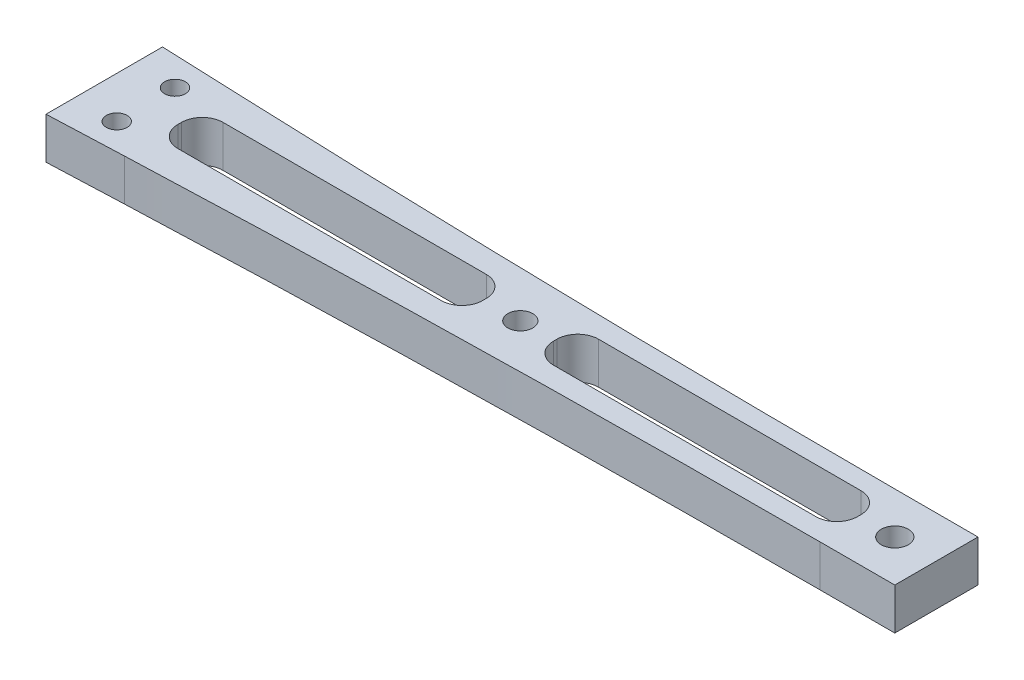
ISO-10303-21;
HEADER;
FILE_DESCRIPTION(('STEP AP214'),'2;1');
FILE_NAME('part.step','',(''),(''),'','','');
FILE_SCHEMA(('AUTOMOTIVE_DESIGN { 1 0 10303 214 1 1 1 1 }'));
ENDSEC;
DATA;
#1=APPLICATION_CONTEXT('core data for automotive mechanical design processes');
#2=APPLICATION_PROTOCOL_DEFINITION('international standard','automotive_design',2000,#1);
#3=PRODUCT_CONTEXT('',#1,'mechanical');
#4=PRODUCT('Part','Part','',(#3));
#5=PRODUCT_RELATED_PRODUCT_CATEGORY('part','',(#4));
#6=PRODUCT_DEFINITION_FORMATION('','',#4);
#7=PRODUCT_DEFINITION_CONTEXT('part definition',#1,'design');
#8=PRODUCT_DEFINITION('design','',#6,#7);
#9=PRODUCT_DEFINITION_SHAPE('','',#8);
#10=(LENGTH_UNIT() NAMED_UNIT(*) SI_UNIT(.MILLI.,.METRE.));
#11=(NAMED_UNIT(*) PLANE_ANGLE_UNIT() SI_UNIT($,.RADIAN.));
#12=(NAMED_UNIT(*) SI_UNIT($,.STERADIAN.) SOLID_ANGLE_UNIT());
#13=UNCERTAINTY_MEASURE_WITH_UNIT(LENGTH_MEASURE(1.E-05),#10,'distance_accuracy_value','');
#14=(GEOMETRIC_REPRESENTATION_CONTEXT(3) GLOBAL_UNCERTAINTY_ASSIGNED_CONTEXT((#13)) GLOBAL_UNIT_ASSIGNED_CONTEXT((#10,
#11,#12)) REPRESENTATION_CONTEXT('',''));
#15=CARTESIAN_POINT('',(0.,0.,0.));
#16=DIRECTION('',(0.,0.,1.));
#17=DIRECTION('',(1.,0.,0.));
#18=AXIS2_PLACEMENT_3D('',#15,#16,#17);
#19=CARTESIAN_POINT('',(113.225148065724,10.,-10.5745762799879));
#20=DIRECTION('',(0.,-1.,0.));
#21=DIRECTION('',(0.,0.,-1.));
#22=AXIS2_PLACEMENT_3D('',#19,#20,#21);
#23=CYLINDRICAL_SURFACE('',#22,5.00000000000001);
#24=CARTESIAN_POINT('',(113.225148065724,0.,-10.5745762799879));
#25=DIRECTION('',(0.,1.,0.));
#26=DIRECTION('',(0.,0.,1.));
#27=AXIS2_PLACEMENT_3D('',#24,#25,#26);
#28=CIRCLE('',#27,5.00000000000001);
#29=CARTESIAN_POINT('',(113.225148065724,0.,-15.5745762799879));
#30=VERTEX_POINT('',#29);
#31=CARTESIAN_POINT('',(108.225148065724,0.,-10.5745762799879));
#32=VERTEX_POINT('',#31);
#33=EDGE_CURVE('E382',#30,#32,#28,.T.);
#34=ORIENTED_EDGE('',*,*,#33,.F.);
#35=DIRECTION('',(0.,-1.,0.));
#36=VECTOR('',#35,1.);
#37=CARTESIAN_POINT('',(113.225148065724,10.,-15.5745762799879));
#38=LINE('',#37,#36);
#39=CARTESIAN_POINT('',(113.225148065724,10.,-15.5745762799879));
#40=VERTEX_POINT('',#39);
#41=EDGE_CURVE('E252',#40,#30,#38,.T.);
#42=ORIENTED_EDGE('',*,*,#41,.F.);
#43=CARTESIAN_POINT('',(113.225148065724,10.,-10.5745762799879));
#44=DIRECTION('',(0.,1.,0.));
#45=DIRECTION('',(0.,0.,1.));
#46=AXIS2_PLACEMENT_3D('',#43,#44,#45);
#47=CIRCLE('',#46,5.00000000000001);
#48=CARTESIAN_POINT('',(108.225148065724,10.,-10.5745762799879));
#49=VERTEX_POINT('',#48);
#50=EDGE_CURVE('E473',#40,#49,#47,.T.);
#51=ORIENTED_EDGE('',*,*,#50,.T.);
#52=DIRECTION('',(0.,-1.,0.));
#53=VECTOR('',#52,1.);
#54=CARTESIAN_POINT('',(108.225148065724,10.,-10.5745762799879));
#55=LINE('',#54,#53);
#56=EDGE_CURVE('E286',#49,#32,#55,.T.);
#57=ORIENTED_EDGE('',*,*,#56,.T.);
#58=EDGE_LOOP('',(#34,#42,#51,#57));
#59=FACE_BOUND('',#58,.T.);
#60=ADVANCED_FACE('F47',(#59),#23,.F.);
#61=CARTESIAN_POINT('',(0.,10.,-15.5745762799879));
#62=DIRECTION('',(0.,0.,-1.));
#63=DIRECTION('',(-1.,0.,0.));
#64=AXIS2_PLACEMENT_3D('',#61,#62,#63);
#65=PLANE('',#64);
#66=DIRECTION('',(1.,0.,0.));
#67=VECTOR('',#66,1.);
#68=CARTESIAN_POINT('',(0.,0.,-15.5745762799879));
#69=LINE('',#68,#67);
#70=CARTESIAN_POINT('',(176.28620966279,0.,-15.5745762799879));
#71=VERTEX_POINT('',#70);
#72=EDGE_CURVE('E386',#30,#71,#69,.T.);
#73=ORIENTED_EDGE('',*,*,#72,.T.);
#74=DIRECTION('',(0.,-1.,0.));
#75=VECTOR('',#74,1.);
#76=CARTESIAN_POINT('',(176.28620966279,10.,-15.5745762799879));
#77=LINE('',#76,#75);
#78=CARTESIAN_POINT('',(176.28620966279,10.,-15.5745762799879));
#79=VERTEX_POINT('',#78);
#80=EDGE_CURVE('E268',#79,#71,#77,.T.);
#81=ORIENTED_EDGE('',*,*,#80,.F.);
#82=DIRECTION('',(1.,0.,0.));
#83=VECTOR('',#82,1.);
#84=CARTESIAN_POINT('',(0.,10.,-15.5745762799879));
#85=LINE('',#84,#83);
#86=EDGE_CURVE('E477',#40,#79,#85,.T.);
#87=ORIENTED_EDGE('',*,*,#86,.F.);
#88=ORIENTED_EDGE('',*,*,#41,.T.);
#89=EDGE_LOOP('',(#73,#81,#87,#88));
#90=FACE_BOUND('',#89,.T.);
#91=ADVANCED_FACE('F529',(#90),#65,.F.);
#92=CARTESIAN_POINT('',(176.28620966279,10.,-10.5745762799879));
#93=DIRECTION('',(0.,-1.,0.));
#94=DIRECTION('',(0.,0.,-1.));
#95=AXIS2_PLACEMENT_3D('',#92,#93,#94);
#96=CYLINDRICAL_SURFACE('',#95,4.99999999999999);
#97=CARTESIAN_POINT('',(176.28620966279,0.,-10.5745762799879));
#98=DIRECTION('',(0.,1.,0.));
#99=DIRECTION('',(0.,0.,1.));
#100=AXIS2_PLACEMENT_3D('',#97,#98,#99);
#101=CIRCLE('',#100,4.99999999999999);
#102=CARTESIAN_POINT('',(181.28620966279,0.,-10.5745762799879));
#103=VERTEX_POINT('',#102);
#104=EDGE_CURVE('E390',#103,#71,#101,.T.);
#105=ORIENTED_EDGE('',*,*,#104,.F.);
#106=DIRECTION('',(0.,-1.,0.));
#107=VECTOR('',#106,1.);
#108=CARTESIAN_POINT('',(181.28620966279,10.,-10.5745762799879));
#109=LINE('',#108,#107);
#110=CARTESIAN_POINT('',(181.28620966279,10.,-10.5745762799879));
#111=VERTEX_POINT('',#110);
#112=EDGE_CURVE('E271',#111,#103,#109,.T.);
#113=ORIENTED_EDGE('',*,*,#112,.F.);
#114=CARTESIAN_POINT('',(176.28620966279,10.,-10.5745762799879));
#115=DIRECTION('',(0.,1.,0.));
#116=DIRECTION('',(0.,0.,1.));
#117=AXIS2_PLACEMENT_3D('',#114,#115,#116);
#118=CIRCLE('',#117,4.99999999999999);
#119=EDGE_CURVE('E480',#111,#79,#118,.T.);
#120=ORIENTED_EDGE('',*,*,#119,.T.);
#121=ORIENTED_EDGE('',*,*,#80,.T.);
#122=EDGE_LOOP('',(#105,#113,#120,#121));
#123=FACE_BOUND('',#122,.T.);
#124=ADVANCED_FACE('F535',(#123),#96,.F.);
#125=CARTESIAN_POINT('',(181.28620966279,10.,0.));
#126=DIRECTION('',(1.,0.,0.));
#127=DIRECTION('',(0.,0.,-1.));
#128=AXIS2_PLACEMENT_3D('',#125,#126,#127);
#129=PLANE('',#128);
#130=DIRECTION('',(0.,0.,1.));
#131=VECTOR('',#130,1.);
#132=CARTESIAN_POINT('',(181.28620966279,0.,0.));
#133=LINE('',#132,#131);
#134=CARTESIAN_POINT('',(181.28620966279,0.,-9.75277634577933));
#135=VERTEX_POINT('',#134);
#136=EDGE_CURVE('E394',#103,#135,#133,.T.);
#137=ORIENTED_EDGE('',*,*,#136,.T.);
#138=DIRECTION('',(0.,-1.,0.));
#139=VECTOR('',#138,1.);
#140=CARTESIAN_POINT('',(181.28620966279,10.,-9.75277634577933));
#141=LINE('',#140,#139);
#142=CARTESIAN_POINT('',(181.28620966279,10.,-9.75277634577933));
#143=VERTEX_POINT('',#142);
#144=EDGE_CURVE('E274',#143,#135,#141,.T.);
#145=ORIENTED_EDGE('',*,*,#144,.F.);
#146=DIRECTION('',(0.,0.,1.));
#147=VECTOR('',#146,1.);
#148=CARTESIAN_POINT('',(181.28620966279,10.,0.));
#149=LINE('',#148,#147);
#150=EDGE_CURVE('E484',#111,#143,#149,.T.);
#151=ORIENTED_EDGE('',*,*,#150,.F.);
#152=ORIENTED_EDGE('',*,*,#112,.T.);
#153=EDGE_LOOP('',(#137,#145,#151,#152));
#154=FACE_BOUND('',#153,.T.);
#155=ADVANCED_FACE('F637',(#154),#129,.F.);
#156=CARTESIAN_POINT('',(176.28620966279,10.,-9.75277634577931));
#157=DIRECTION('',(0.,-1.,0.));
#158=DIRECTION('',(0.,0.,-1.));
#159=AXIS2_PLACEMENT_3D('',#156,#157,#158);
#160=CYLINDRICAL_SURFACE('',#159,4.99999999999999);
#161=CARTESIAN_POINT('',(176.28620966279,0.,-9.75277634577931));
#162=DIRECTION('',(0.,1.,0.));
#163=DIRECTION('',(0.,0.,1.));
#164=AXIS2_PLACEMENT_3D('',#161,#162,#163);
#165=CIRCLE('',#164,4.99999999999999);
#166=CARTESIAN_POINT('',(176.28620966279,0.,-4.75277634577932));
#167=VERTEX_POINT('',#166);
#168=EDGE_CURVE('E398',#167,#135,#165,.T.);
#169=ORIENTED_EDGE('',*,*,#168,.F.);
#170=DIRECTION('',(0.,-1.,0.));
#171=VECTOR('',#170,1.);
#172=CARTESIAN_POINT('',(176.28620966279,10.,-4.75277634577932));
#173=LINE('',#172,#171);
#174=CARTESIAN_POINT('',(176.28620966279,10.,-4.75277634577932));
#175=VERTEX_POINT('',#174);
#176=EDGE_CURVE('E277',#175,#167,#173,.T.);
#177=ORIENTED_EDGE('',*,*,#176,.F.);
#178=CARTESIAN_POINT('',(176.28620966279,10.,-9.75277634577931));
#179=DIRECTION('',(0.,1.,0.));
#180=DIRECTION('',(0.,0.,1.));
#181=AXIS2_PLACEMENT_3D('',#178,#179,#180);
#182=CIRCLE('',#181,4.99999999999999);
#183=EDGE_CURVE('E487',#175,#143,#182,.T.);
#184=ORIENTED_EDGE('',*,*,#183,.T.);
#185=ORIENTED_EDGE('',*,*,#144,.T.);
#186=EDGE_LOOP('',(#169,#177,#184,#185));
#187=FACE_BOUND('',#186,.T.);
#188=ADVANCED_FACE('F633',(#187),#160,.F.);
#189=CARTESIAN_POINT('',(0.,10.,-4.75277634577934));
#190=DIRECTION('',(0.,0.,-1.));
#191=DIRECTION('',(-1.,0.,0.));
#192=AXIS2_PLACEMENT_3D('',#189,#190,#191);
#193=PLANE('',#192);
#194=DIRECTION('',(1.,0.,0.));
#195=VECTOR('',#194,1.);
#196=CARTESIAN_POINT('',(0.,0.,-4.75277634577934));
#197=LINE('',#196,#195);
#198=CARTESIAN_POINT('',(113.225148065724,0.,-4.75277634577933));
#199=VERTEX_POINT('',#198);
#200=EDGE_CURVE('E402',#199,#167,#197,.T.);
#201=ORIENTED_EDGE('',*,*,#200,.F.);
#202=DIRECTION('',(0.,-1.,0.));
#203=VECTOR('',#202,1.);
#204=CARTESIAN_POINT('',(113.225148065724,10.,-4.75277634577933));
#205=LINE('',#204,#203);
#206=CARTESIAN_POINT('',(113.225148065724,10.,-4.75277634577933));
#207=VERTEX_POINT('',#206);
#208=EDGE_CURVE('E280',#207,#199,#205,.T.);
#209=ORIENTED_EDGE('',*,*,#208,.F.);
#210=DIRECTION('',(1.,0.,0.));
#211=VECTOR('',#210,1.);
#212=CARTESIAN_POINT('',(0.,10.,-4.75277634577934));
#213=LINE('',#212,#211);
#214=EDGE_CURVE('E491',#207,#175,#213,.T.);
#215=ORIENTED_EDGE('',*,*,#214,.T.);
#216=ORIENTED_EDGE('',*,*,#176,.T.);
#217=EDGE_LOOP('',(#201,#209,#215,#216));
#218=FACE_BOUND('',#217,.T.);
#219=ADVANCED_FACE('F629',(#218),#193,.T.);
#220=CARTESIAN_POINT('',(113.225148065724,10.,-9.75277634577931));
#221=DIRECTION('',(0.,-1.,0.));
#222=DIRECTION('',(0.,0.,-1.));
#223=AXIS2_PLACEMENT_3D('',#220,#221,#222);
#224=CYLINDRICAL_SURFACE('',#223,5.);
#225=CARTESIAN_POINT('',(113.225148065724,0.,-9.75277634577931));
#226=DIRECTION('',(0.,1.,0.));
#227=DIRECTION('',(0.,0.,1.));
#228=AXIS2_PLACEMENT_3D('',#225,#226,#227);
#229=CIRCLE('',#228,5.);
#230=CARTESIAN_POINT('',(108.225148065724,0.,-9.75277634577933));
#231=VERTEX_POINT('',#230);
#232=EDGE_CURVE('E406',#199,#231,#229,.F.);
#233=ORIENTED_EDGE('',*,*,#232,.T.);
#234=DIRECTION('',(0.,-1.,0.));
#235=VECTOR('',#234,1.);
#236=CARTESIAN_POINT('',(108.225148065724,10.,-9.75277634577933));
#237=LINE('',#236,#235);
#238=CARTESIAN_POINT('',(108.225148065724,10.,-9.75277634577933));
#239=VERTEX_POINT('',#238);
#240=EDGE_CURVE('E283',#239,#231,#237,.T.);
#241=ORIENTED_EDGE('',*,*,#240,.F.);
#242=CARTESIAN_POINT('',(113.225148065724,10.,-9.75277634577931));
#243=DIRECTION('',(0.,1.,0.));
#244=DIRECTION('',(0.,0.,1.));
#245=AXIS2_PLACEMENT_3D('',#242,#243,#244);
#246=CIRCLE('',#245,5.);
#247=EDGE_CURVE('E495',#207,#239,#246,.F.);
#248=ORIENTED_EDGE('',*,*,#247,.F.);
#249=ORIENTED_EDGE('',*,*,#208,.T.);
#250=EDGE_LOOP('',(#233,#241,#248,#249));
#251=FACE_BOUND('',#250,.T.);
#252=ADVANCED_FACE('F572',(#251),#224,.F.);
#253=CARTESIAN_POINT('',(22.9848223233018,10.,-10.5745762799879));
#254=DIRECTION('',(0.,-1.,0.));
#255=DIRECTION('',(0.,0.,-1.));
#256=AXIS2_PLACEMENT_3D('',#253,#254,#255);
#257=CYLINDRICAL_SURFACE('',#256,5.00000000000001);
#258=CARTESIAN_POINT('',(22.9848223233018,0.,-10.5745762799879));
#259=DIRECTION('',(0.,1.,0.));
#260=DIRECTION('',(0.,0.,1.));
#261=AXIS2_PLACEMENT_3D('',#258,#259,#260);
#262=CIRCLE('',#261,5.00000000000001);
#263=CARTESIAN_POINT('',(22.9848223233018,0.,-15.5745762799879));
#264=VERTEX_POINT('',#263);
#265=CARTESIAN_POINT('',(17.9848223233018,0.,-10.5745762799879));
#266=VERTEX_POINT('',#265);
#267=EDGE_CURVE('E350',#264,#266,#262,.T.);
#268=ORIENTED_EDGE('',*,*,#267,.F.);
#269=DIRECTION('',(0.,-1.,0.));
#270=VECTOR('',#269,1.);
#271=CARTESIAN_POINT('',(22.9848223233018,10.,-15.5745762799879));
#272=LINE('',#271,#270);
#273=CARTESIAN_POINT('',(22.9848223233018,10.,-15.5745762799879));
#274=VERTEX_POINT('',#273);
#275=EDGE_CURVE('E289',#274,#264,#272,.T.);
#276=ORIENTED_EDGE('',*,*,#275,.F.);
#277=CARTESIAN_POINT('',(22.9848223233018,10.,-10.5745762799879));
#278=DIRECTION('',(0.,1.,0.));
#279=DIRECTION('',(0.,0.,1.));
#280=AXIS2_PLACEMENT_3D('',#277,#278,#279);
#281=CIRCLE('',#280,5.00000000000001);
#282=CARTESIAN_POINT('',(17.9848223233018,10.,-10.5745762799879));
#283=VERTEX_POINT('',#282);
#284=EDGE_CURVE('E444',#274,#283,#281,.T.);
#285=ORIENTED_EDGE('',*,*,#284,.T.);
#286=DIRECTION('',(0.,-1.,0.));
#287=VECTOR('',#286,1.);
#288=CARTESIAN_POINT('',(17.9848223233018,10.,-10.5745762799879));
#289=LINE('',#288,#287);
#290=EDGE_CURVE('E238',#283,#266,#289,.T.);
#291=ORIENTED_EDGE('',*,*,#290,.T.);
#292=EDGE_LOOP('',(#268,#276,#285,#291));
#293=FACE_BOUND('',#292,.T.);
#294=ADVANCED_FACE('F568',(#293),#257,.F.);
#295=CARTESIAN_POINT('',(0.,10.,-15.5745762799879));
#296=DIRECTION('',(0.,0.,-1.));
#297=DIRECTION('',(-1.,0.,0.));
#298=AXIS2_PLACEMENT_3D('',#295,#296,#297);
#299=PLANE('',#298);
#300=DIRECTION('',(1.,0.,0.));
#301=VECTOR('',#300,1.);
#302=CARTESIAN_POINT('',(0.,0.,-15.5745762799879));
#303=LINE('',#302,#301);
#304=CARTESIAN_POINT('',(86.2593923796302,0.,-15.5745762799879));
#305=VERTEX_POINT('',#304);
#306=EDGE_CURVE('E354',#264,#305,#303,.T.);
#307=ORIENTED_EDGE('',*,*,#306,.T.);
#308=DIRECTION('',(0.,-1.,0.));
#309=VECTOR('',#308,1.);
#310=CARTESIAN_POINT('',(86.2593923796302,10.,-15.5745762799879));
#311=LINE('',#310,#309);
#312=CARTESIAN_POINT('',(86.2593923796302,10.,-15.5745762799879));
#313=VERTEX_POINT('',#312);
#314=EDGE_CURVE('E292',#313,#305,#311,.T.);
#315=ORIENTED_EDGE('',*,*,#314,.F.);
#316=DIRECTION('',(1.,0.,0.));
#317=VECTOR('',#316,1.);
#318=CARTESIAN_POINT('',(0.,10.,-15.5745762799879));
#319=LINE('',#318,#317);
#320=EDGE_CURVE('E448',#274,#313,#319,.T.);
#321=ORIENTED_EDGE('',*,*,#320,.F.);
#322=ORIENTED_EDGE('',*,*,#275,.T.);
#323=EDGE_LOOP('',(#307,#315,#321,#322));
#324=FACE_BOUND('',#323,.T.);
#325=ADVANCED_FACE('F564',(#324),#299,.F.);
#326=CARTESIAN_POINT('',(86.2593923796302,10.,-10.5745762799879));
#327=DIRECTION('',(0.,-1.,0.));
#328=DIRECTION('',(0.,0.,-1.));
#329=AXIS2_PLACEMENT_3D('',#326,#327,#328);
#330=CYLINDRICAL_SURFACE('',#329,4.99999999999999);
#331=CARTESIAN_POINT('',(86.2593923796302,0.,-10.5745762799879));
#332=DIRECTION('',(0.,1.,0.));
#333=DIRECTION('',(0.,0.,1.));
#334=AXIS2_PLACEMENT_3D('',#331,#332,#333);
#335=CIRCLE('',#334,4.99999999999999);
#336=CARTESIAN_POINT('',(91.2593923796302,0.,-10.5745762799879));
#337=VERTEX_POINT('',#336);
#338=EDGE_CURVE('E358',#337,#305,#335,.T.);
#339=ORIENTED_EDGE('',*,*,#338,.F.);
#340=DIRECTION('',(0.,-1.,0.));
#341=VECTOR('',#340,1.);
#342=CARTESIAN_POINT('',(91.2593923796302,10.,-10.5745762799879));
#343=LINE('',#342,#341);
#344=CARTESIAN_POINT('',(91.2593923796302,10.,-10.5745762799879));
#345=VERTEX_POINT('',#344);
#346=EDGE_CURVE('E295',#345,#337,#343,.T.);
#347=ORIENTED_EDGE('',*,*,#346,.F.);
#348=CARTESIAN_POINT('',(86.2593923796302,10.,-10.5745762799879));
#349=DIRECTION('',(0.,1.,0.));
#350=DIRECTION('',(0.,0.,1.));
#351=AXIS2_PLACEMENT_3D('',#348,#349,#350);
#352=CIRCLE('',#351,4.99999999999999);
#353=EDGE_CURVE('E451',#345,#313,#352,.T.);
#354=ORIENTED_EDGE('',*,*,#353,.T.);
#355=ORIENTED_EDGE('',*,*,#314,.T.);
#356=EDGE_LOOP('',(#339,#347,#354,#355));
#357=FACE_BOUND('',#356,.T.);
#358=ADVANCED_FACE('F560',(#357),#330,.F.);
#359=CARTESIAN_POINT('',(91.2593923796302,10.,0.));
#360=DIRECTION('',(1.,0.,0.));
#361=DIRECTION('',(0.,0.,-1.));
#362=AXIS2_PLACEMENT_3D('',#359,#360,#361);
#363=PLANE('',#362);
#364=DIRECTION('',(0.,0.,1.));
#365=VECTOR('',#364,1.);
#366=CARTESIAN_POINT('',(91.2593923796302,0.,0.));
#367=LINE('',#366,#365);
#368=CARTESIAN_POINT('',(91.2593923796302,0.,-9.69671937911455));
#369=VERTEX_POINT('',#368);
#370=EDGE_CURVE('E362',#337,#369,#367,.T.);
#371=ORIENTED_EDGE('',*,*,#370,.T.);
#372=DIRECTION('',(0.,-1.,0.));
#373=VECTOR('',#372,1.);
#374=CARTESIAN_POINT('',(91.2593923796302,10.,-9.69671937911455));
#375=LINE('',#374,#373);
#376=CARTESIAN_POINT('',(91.2593923796302,10.,-9.69671937911455));
#377=VERTEX_POINT('',#376);
#378=EDGE_CURVE('E298',#377,#369,#375,.T.);
#379=ORIENTED_EDGE('',*,*,#378,.F.);
#380=DIRECTION('',(0.,0.,1.));
#381=VECTOR('',#380,1.);
#382=CARTESIAN_POINT('',(91.2593923796302,10.,0.));
#383=LINE('',#382,#381);
#384=EDGE_CURVE('E455',#345,#377,#383,.T.);
#385=ORIENTED_EDGE('',*,*,#384,.F.);
#386=ORIENTED_EDGE('',*,*,#346,.T.);
#387=EDGE_LOOP('',(#371,#379,#385,#386));
#388=FACE_BOUND('',#387,.T.);
#389=ADVANCED_FACE('F556',(#388),#363,.F.);
#390=CARTESIAN_POINT('',(86.2593923796302,10.,-9.69671937911454));
#391=DIRECTION('',(0.,-1.,0.));
#392=DIRECTION('',(0.,0.,-1.));
#393=AXIS2_PLACEMENT_3D('',#390,#391,#392);
#394=CYLINDRICAL_SURFACE('',#393,4.99999999999999);
#395=CARTESIAN_POINT('',(86.2593923796302,0.,-9.69671937911454));
#396=DIRECTION('',(0.,1.,0.));
#397=DIRECTION('',(0.,0.,1.));
#398=AXIS2_PLACEMENT_3D('',#395,#396,#397);
#399=CIRCLE('',#398,4.99999999999999);
#400=CARTESIAN_POINT('',(86.2593923796302,0.,-4.69671937911453));
#401=VERTEX_POINT('',#400);
#402=EDGE_CURVE('E366',#401,#369,#399,.T.);
#403=ORIENTED_EDGE('',*,*,#402,.F.);
#404=DIRECTION('',(0.,-1.,0.));
#405=VECTOR('',#404,1.);
#406=CARTESIAN_POINT('',(86.2593923796302,10.,-4.69671937911453));
#407=LINE('',#406,#405);
#408=CARTESIAN_POINT('',(86.2593923796302,10.,-4.69671937911453));
#409=VERTEX_POINT('',#408);
#410=EDGE_CURVE('E301',#409,#401,#407,.T.);
#411=ORIENTED_EDGE('',*,*,#410,.F.);
#412=CARTESIAN_POINT('',(86.2593923796302,10.,-9.69671937911454));
#413=DIRECTION('',(0.,1.,0.));
#414=DIRECTION('',(0.,0.,1.));
#415=AXIS2_PLACEMENT_3D('',#412,#413,#414);
#416=CIRCLE('',#415,4.99999999999999);
#417=EDGE_CURVE('E458',#409,#377,#416,.T.);
#418=ORIENTED_EDGE('',*,*,#417,.T.);
#419=ORIENTED_EDGE('',*,*,#378,.T.);
#420=EDGE_LOOP('',(#403,#411,#418,#419));
#421=FACE_BOUND('',#420,.T.);
#422=ADVANCED_FACE('F552',(#421),#394,.F.);
#423=CARTESIAN_POINT('',(0.,10.,-4.69671937911455));
#424=DIRECTION('',(0.,0.,-1.));
#425=DIRECTION('',(-1.,0.,0.));
#426=AXIS2_PLACEMENT_3D('',#423,#424,#425);
#427=PLANE('',#426);
#428=DIRECTION('',(1.,0.,0.));
#429=VECTOR('',#428,1.);
#430=CARTESIAN_POINT('',(0.,0.,-4.69671937911455));
#431=LINE('',#430,#429);
#432=CARTESIAN_POINT('',(22.9848223233018,0.,-4.69671937911455));
#433=VERTEX_POINT('',#432);
#434=EDGE_CURVE('E370',#433,#401,#431,.T.);
#435=ORIENTED_EDGE('',*,*,#434,.F.);
#436=DIRECTION('',(0.,-1.,0.));
#437=VECTOR('',#436,1.);
#438=CARTESIAN_POINT('',(22.9848223233018,10.,-4.69671937911455));
#439=LINE('',#438,#437);
#440=CARTESIAN_POINT('',(22.9848223233018,10.,-4.69671937911455));
#441=VERTEX_POINT('',#440);
#442=EDGE_CURVE('E304',#441,#433,#439,.T.);
#443=ORIENTED_EDGE('',*,*,#442,.F.);
#444=DIRECTION('',(1.,0.,0.));
#445=VECTOR('',#444,1.);
#446=CARTESIAN_POINT('',(0.,10.,-4.69671937911455));
#447=LINE('',#446,#445);
#448=EDGE_CURVE('E462',#441,#409,#447,.T.);
#449=ORIENTED_EDGE('',*,*,#448,.T.);
#450=ORIENTED_EDGE('',*,*,#410,.T.);
#451=EDGE_LOOP('',(#435,#443,#449,#450));
#452=FACE_BOUND('',#451,.T.);
#453=ADVANCED_FACE('F548',(#452),#427,.T.);
#454=CARTESIAN_POINT('',(22.9848223233018,10.,-9.69671937911454));
#455=DIRECTION('',(0.,-1.,0.));
#456=DIRECTION('',(0.,0.,-1.));
#457=AXIS2_PLACEMENT_3D('',#454,#455,#456);
#458=CYLINDRICAL_SURFACE('',#457,5.);
#459=CARTESIAN_POINT('',(22.9848223233018,0.,-9.69671937911454));
#460=DIRECTION('',(0.,1.,0.));
#461=DIRECTION('',(0.,0.,1.));
#462=AXIS2_PLACEMENT_3D('',#459,#460,#461);
#463=CIRCLE('',#462,5.);
#464=CARTESIAN_POINT('',(17.9848223233018,0.,-9.69671937911455));
#465=VERTEX_POINT('',#464);
#466=EDGE_CURVE('E374',#465,#433,#463,.T.);
#467=ORIENTED_EDGE('',*,*,#466,.F.);
#468=DIRECTION('',(0.,-1.,0.));
#469=VECTOR('',#468,1.);
#470=CARTESIAN_POINT('',(17.9848223233018,10.,-9.69671937911455));
#471=LINE('',#470,#469);
#472=CARTESIAN_POINT('',(17.9848223233018,10.,-9.69671937911455));
#473=VERTEX_POINT('',#472);
#474=EDGE_CURVE('E242',#473,#465,#471,.T.);
#475=ORIENTED_EDGE('',*,*,#474,.F.);
#476=CARTESIAN_POINT('',(22.9848223233018,10.,-9.69671937911454));
#477=DIRECTION('',(0.,1.,0.));
#478=DIRECTION('',(0.,0.,1.));
#479=AXIS2_PLACEMENT_3D('',#476,#477,#478);
#480=CIRCLE('',#479,5.);
#481=EDGE_CURVE('E466',#473,#441,#480,.T.);
#482=ORIENTED_EDGE('',*,*,#481,.T.);
#483=ORIENTED_EDGE('',*,*,#442,.T.);
#484=EDGE_LOOP('',(#467,#475,#482,#483));
#485=FACE_BOUND('',#484,.T.);
#486=ADVANCED_FACE('F545',(#485),#458,.F.);
#487=CARTESIAN_POINT('',(0.958466453674131,10.,-23.961661341853));
#488=DIRECTION('',(-0.039968038348872,0.,0.999200958721789));
#489=DIRECTION('',(0.999200958721789,0.,0.039968038348872));
#490=AXIS2_PLACEMENT_3D('',#487,#488,#489);
#491=PLANE('',#490);
#492=DIRECTION('',(-0.999200958721789,0.,-0.039968038348872));
#493=VECTOR('',#492,1.);
#494=CARTESIAN_POINT('',(0.958466453674131,10.,-23.961661341853));
#495=LINE('',#494,#493);
#496=CARTESIAN_POINT('',(18.0982689834271,10.,-23.2760692406629));
#497=VERTEX_POINT('',#496);
#498=CARTESIAN_POINT('',(0.,10.,-24.));
#499=VERTEX_POINT('',#498);
#500=EDGE_CURVE('E208',#497,#499,#495,.T.);
#501=ORIENTED_EDGE('',*,*,#500,.F.);
#502=DIRECTION('',(0.,-1.,0.));
#503=VECTOR('',#502,1.);
#504=CARTESIAN_POINT('',(18.0982689834271,0.,-23.2760692406629));
#505=LINE('',#504,#503);
#506=CARTESIAN_POINT('',(18.0982689834271,0.,-23.2760692406629));
#507=VERTEX_POINT('',#506);
#508=EDGE_CURVE('E248',#497,#507,#505,.T.);
#509=ORIENTED_EDGE('',*,*,#508,.T.);
#510=DIRECTION('',(-0.999200958721789,0.,-0.039968038348872));
#511=VECTOR('',#510,1.);
#512=CARTESIAN_POINT('',(0.958466453674131,0.,-23.961661341853));
#513=LINE('',#512,#511);
#514=CARTESIAN_POINT('',(0.,0.,-24.));
#515=VERTEX_POINT('',#514);
#516=EDGE_CURVE('E235',#507,#515,#513,.T.);
#517=ORIENTED_EDGE('',*,*,#516,.T.);
#518=DIRECTION('',(0.,-1.,0.));
#519=VECTOR('',#518,1.);
#520=CARTESIAN_POINT('',(0.,10.,-24.));
#521=LINE('',#520,#519);
#522=EDGE_CURVE('E227',#499,#515,#521,.T.);
#523=ORIENTED_EDGE('',*,*,#522,.F.);
#524=EDGE_LOOP('',(#501,#509,#517,#523));
#525=FACE_BOUND('',#524,.T.);
#526=ADVANCED_FACE('F233',(#525),#491,.F.);
#527=CARTESIAN_POINT('',(0.,10.,0.));
#528=DIRECTION('',(1.,0.,0.));
#529=DIRECTION('',(0.,0.,-1.));
#530=AXIS2_PLACEMENT_3D('',#527,#528,#529);
#531=PLANE('',#530);
#532=DIRECTION('',(0.,0.,1.));
#533=VECTOR('',#532,1.);
#534=CARTESIAN_POINT('',(0.,0.,0.));
#535=LINE('',#534,#533);
#536=CARTESIAN_POINT('',(0.,0.,4.));
#537=VERTEX_POINT('',#536);
#538=EDGE_CURVE('E344',#515,#537,#535,.T.);
#539=ORIENTED_EDGE('',*,*,#538,.T.);
#540=DIRECTION('',(0.,-1.,0.));
#541=VECTOR('',#540,1.);
#542=CARTESIAN_POINT('',(0.,10.,4.));
#543=LINE('',#542,#541);
#544=CARTESIAN_POINT('',(0.,10.,4.));
#545=VERTEX_POINT('',#544);
#546=EDGE_CURVE('E229',#545,#537,#543,.T.);
#547=ORIENTED_EDGE('',*,*,#546,.F.);
#548=DIRECTION('',(0.,0.,1.));
#549=VECTOR('',#548,1.);
#550=CARTESIAN_POINT('',(0.,10.,0.));
#551=LINE('',#550,#549);
#552=EDGE_CURVE('E213',#499,#545,#551,.T.);
#553=ORIENTED_EDGE('',*,*,#552,.F.);
#554=ORIENTED_EDGE('',*,*,#522,.T.);
#555=EDGE_LOOP('',(#539,#547,#553,#554));
#556=FACE_BOUND('',#555,.T.);
#557=ADVANCED_FACE('F226',(#556),#531,.F.);
#558=CARTESIAN_POINT('',(0.159744408945687,10.,3.99361022364217));
#559=DIRECTION('',(-0.0399680383488716,0.,-0.99920095872179));
#560=DIRECTION('',(-0.999200958721789,0.,0.0399680383488716));
#561=AXIS2_PLACEMENT_3D('',#558,#559,#560);
#562=PLANE('',#561);
#563=DIRECTION('',(0.99920095872179,0.,-0.0399680383488716));
#564=VECTOR('',#563,1.);
#565=CARTESIAN_POINT('',(0.159744408945687,0.,3.99361022364217));
#566=LINE('',#565,#564);
#567=CARTESIAN_POINT('',(18.0982689834269,0.,3.27606924066292));
#568=VERTEX_POINT('',#567);
#569=EDGE_CURVE('E341',#537,#568,#566,.T.);
#570=ORIENTED_EDGE('',*,*,#569,.T.);
#571=DIRECTION('',(0.,-1.,0.));
#572=VECTOR('',#571,1.);
#573=CARTESIAN_POINT('',(18.0982689834269,10.,3.27606924066292));
#574=LINE('',#573,#572);
#575=CARTESIAN_POINT('',(18.0982689834269,10.,3.27606924066292));
#576=VERTEX_POINT('',#575);
#577=EDGE_CURVE('E63',#568,#576,#574,.F.);
#578=ORIENTED_EDGE('',*,*,#577,.T.);
#579=DIRECTION('',(0.99920095872179,0.,-0.0399680383488716));
#580=VECTOR('',#579,1.);
#581=CARTESIAN_POINT('',(0.159744408945687,10.,3.99361022364217));
#582=LINE('',#581,#580);
#583=EDGE_CURVE('E231',#545,#576,#582,.T.);
#584=ORIENTED_EDGE('',*,*,#583,.F.);
#585=ORIENTED_EDGE('',*,*,#546,.T.);
#586=EDGE_LOOP('',(#570,#578,#584,#585));
#587=FACE_BOUND('',#586,.T.);
#588=ADVANCED_FACE('F519',(#587),#562,.F.);
#589=CARTESIAN_POINT('',(0.,10.,0.));
#590=DIRECTION('',(0.,0.,1.));
#591=DIRECTION('',(1.,0.,0.));
#592=AXIS2_PLACEMENT_3D('',#589,#590,#591);
#593=PLANE('',#592);
#594=DIRECTION('',(-1.,0.,0.));
#595=VECTOR('',#594,1.);
#596=CARTESIAN_POINT('',(0.,10.,0.));
#597=LINE('',#596,#595);
#598=CARTESIAN_POINT('',(200.,10.,0.));
#599=VERTEX_POINT('',#598);
#600=CARTESIAN_POINT('',(181.967226213798,10.,0.));
#601=VERTEX_POINT('',#600);
#602=EDGE_CURVE('E436',#599,#601,#597,.T.);
#603=ORIENTED_EDGE('',*,*,#602,.T.);
#604=DIRECTION('',(0.,-1.,0.));
#605=VECTOR('',#604,1.);
#606=CARTESIAN_POINT('',(181.967226213798,10.,0.));
#607=LINE('',#606,#605);
#608=CARTESIAN_POINT('',(181.967226213798,0.,0.));
#609=VERTEX_POINT('',#608);
#610=EDGE_CURVE('E255',#601,#609,#607,.T.);
#611=ORIENTED_EDGE('',*,*,#610,.T.);
#612=DIRECTION('',(-1.,0.,0.));
#613=VECTOR('',#612,1.);
#614=CARTESIAN_POINT('',(0.,0.,0.));
#615=LINE('',#614,#613);
#616=CARTESIAN_POINT('',(200.,0.,0.));
#617=VERTEX_POINT('',#616);
#618=EDGE_CURVE('E333',#617,#609,#615,.T.);
#619=ORIENTED_EDGE('',*,*,#618,.F.);
#620=DIRECTION('',(0.,-1.,0.));
#621=VECTOR('',#620,1.);
#622=CARTESIAN_POINT('',(200.,10.,0.));
#623=LINE('',#622,#621);
#624=EDGE_CURVE('E244',#599,#617,#623,.T.);
#625=ORIENTED_EDGE('',*,*,#624,.F.);
#626=EDGE_LOOP('',(#603,#611,#619,#625));
#627=FACE_BOUND('',#626,.T.);
#628=ADVANCED_FACE('F338',(#627),#593,.T.);
#629=CARTESIAN_POINT('',(200.,10.,0.));
#630=DIRECTION('',(-1.,0.,0.));
#631=DIRECTION('',(0.,0.,1.));
#632=AXIS2_PLACEMENT_3D('',#629,#630,#631);
#633=PLANE('',#632);
#634=DIRECTION('',(0.,0.,-1.));
#635=VECTOR('',#634,1.);
#636=CARTESIAN_POINT('',(200.,0.,0.));
#637=LINE('',#636,#635);
#638=CARTESIAN_POINT('',(200.,0.,-20.));
#639=VERTEX_POINT('',#638);
#640=EDGE_CURVE('E324',#617,#639,#637,.T.);
#641=ORIENTED_EDGE('',*,*,#640,.T.);
#642=DIRECTION('',(0.,-1.,0.));
#643=VECTOR('',#642,1.);
#644=CARTESIAN_POINT('',(200.,10.,-20.));
#645=LINE('',#644,#643);
#646=CARTESIAN_POINT('',(200.,10.,-20.));
#647=VERTEX_POINT('',#646);
#648=EDGE_CURVE('E314',#647,#639,#645,.T.);
#649=ORIENTED_EDGE('',*,*,#648,.F.);
#650=DIRECTION('',(0.,0.,-1.));
#651=VECTOR('',#650,1.);
#652=CARTESIAN_POINT('',(200.,10.,0.));
#653=LINE('',#652,#651);
#654=EDGE_CURVE('E325',#599,#647,#653,.T.);
#655=ORIENTED_EDGE('',*,*,#654,.F.);
#656=ORIENTED_EDGE('',*,*,#624,.T.);
#657=EDGE_LOOP('',(#641,#649,#655,#656));
#658=FACE_BOUND('',#657,.T.);
#659=ADVANCED_FACE('F322',(#658),#633,.F.);
#660=CARTESIAN_POINT('',(17.9848223233018,10.,0.));
#661=DIRECTION('',(1.,0.,0.));
#662=DIRECTION('',(0.,0.,-1.));
#663=AXIS2_PLACEMENT_3D('',#660,#661,#662);
#664=PLANE('',#663);
#665=DIRECTION('',(0.,0.,1.));
#666=VECTOR('',#665,1.);
#667=CARTESIAN_POINT('',(17.9848223233018,0.,0.));
#668=LINE('',#667,#666);
#669=EDGE_CURVE('E378',#266,#465,#668,.T.);
#670=ORIENTED_EDGE('',*,*,#669,.F.);
#671=ORIENTED_EDGE('',*,*,#290,.F.);
#672=DIRECTION('',(0.,0.,1.));
#673=VECTOR('',#672,1.);
#674=CARTESIAN_POINT('',(17.9848223233018,10.,0.));
#675=LINE('',#674,#673);
#676=EDGE_CURVE('E470',#283,#473,#675,.T.);
#677=ORIENTED_EDGE('',*,*,#676,.T.);
#678=ORIENTED_EDGE('',*,*,#474,.T.);
#679=EDGE_LOOP('',(#670,#671,#677,#678));
#680=FACE_BOUND('',#679,.T.);
#681=ADVANCED_FACE('F541',(#680),#664,.T.);
#682=CARTESIAN_POINT('',(0.,10.,-20.));
#683=DIRECTION('',(0.,0.,1.));
#684=DIRECTION('',(1.,0.,0.));
#685=AXIS2_PLACEMENT_3D('',#682,#683,#684);
#686=PLANE('',#685);
#687=DIRECTION('',(-1.,0.,0.));
#688=VECTOR('',#687,1.);
#689=CARTESIAN_POINT('',(0.,0.,-20.));
#690=LINE('',#689,#688);
#691=CARTESIAN_POINT('',(181.967226213802,0.,-20.));
#692=VERTEX_POINT('',#691);
#693=EDGE_CURVE('E335',#639,#692,#690,.T.);
#694=ORIENTED_EDGE('',*,*,#693,.T.);
#695=DIRECTION('',(0.,-1.,0.));
#696=VECTOR('',#695,1.);
#697=CARTESIAN_POINT('',(181.967226213802,10.,-20.));
#698=LINE('',#697,#696);
#699=CARTESIAN_POINT('',(181.967226213802,10.,-20.));
#700=VERTEX_POINT('',#699);
#701=EDGE_CURVE('E251',#692,#700,#698,.F.);
#702=ORIENTED_EDGE('',*,*,#701,.T.);
#703=DIRECTION('',(-1.,0.,0.));
#704=VECTOR('',#703,1.);
#705=CARTESIAN_POINT('',(0.,10.,-20.));
#706=LINE('',#705,#704);
#707=EDGE_CURVE('E441',#647,#700,#706,.T.);
#708=ORIENTED_EDGE('',*,*,#707,.F.);
#709=ORIENTED_EDGE('',*,*,#648,.T.);
#710=EDGE_LOOP('',(#694,#702,#708,#709));
#711=FACE_BOUND('',#710,.T.);
#712=ADVANCED_FACE('F544',(#711),#686,.F.);
#713=CARTESIAN_POINT('',(10.,10.,-17.));
#714=DIRECTION('',(0.,-1.,0.));
#715=DIRECTION('',(0.,0.,-1.));
#716=AXIS2_PLACEMENT_3D('',#713,#714,#715);
#717=CYLINDRICAL_SURFACE('',#716,2.5);
#718=CARTESIAN_POINT('',(10.,10.,-17.));
#719=DIRECTION('',(0.,1.,0.));
#720=DIRECTION('',(0.,0.,1.));
#721=AXIS2_PLACEMENT_3D('',#718,#719,#720);
#722=CIRCLE('',#721,2.5);
#723=CARTESIAN_POINT('',(10.,10.,-14.5));
#724=VERTEX_POINT('',#723);
#725=EDGE_CURVE('E222',#724,#724,#722,.T.);
#726=ORIENTED_EDGE('',*,*,#725,.T.);
#727=EDGE_LOOP('',(#726));
#728=FACE_BOUND('',#727,.T.);
#729=CARTESIAN_POINT('',(10.,0.,-17.));
#730=DIRECTION('',(0.,1.,0.));
#731=DIRECTION('',(0.,0.,1.));
#732=AXIS2_PLACEMENT_3D('',#729,#730,#731);
#733=CIRCLE('',#732,2.5);
#734=CARTESIAN_POINT('',(10.,0.,-14.5));
#735=VERTEX_POINT('',#734);
#736=EDGE_CURVE('E513',#735,#735,#733,.T.);
#737=ORIENTED_EDGE('',*,*,#736,.F.);
#738=EDGE_LOOP('',(#737));
#739=FACE_BOUND('',#738,.T.);
#740=ADVANCED_FACE('F576',(#728,#739),#717,.F.);
#741=CARTESIAN_POINT('',(190.,10.,-10.));
#742=DIRECTION('',(0.,-1.,0.));
#743=DIRECTION('',(0.,0.,-1.));
#744=AXIS2_PLACEMENT_3D('',#741,#742,#743);
#745=CYLINDRICAL_SURFACE('',#744,3.25000000000001);
#746=CARTESIAN_POINT('',(190.,10.,-10.));
#747=DIRECTION('',(0.,1.,0.));
#748=DIRECTION('',(0.,0.,1.));
#749=AXIS2_PLACEMENT_3D('',#746,#747,#748);
#750=CIRCLE('',#749,3.25000000000001);
#751=CARTESIAN_POINT('',(190.,10.,-6.74999999999999));
#752=VERTEX_POINT('',#751);
#753=EDGE_CURVE('E425',#752,#752,#750,.T.);
#754=ORIENTED_EDGE('',*,*,#753,.T.);
#755=EDGE_LOOP('',(#754));
#756=FACE_BOUND('',#755,.T.);
#757=CARTESIAN_POINT('',(190.,0.,-10.));
#758=DIRECTION('',(0.,1.,0.));
#759=DIRECTION('',(0.,0.,1.));
#760=AXIS2_PLACEMENT_3D('',#757,#758,#759);
#761=CIRCLE('',#760,3.25000000000001);
#762=CARTESIAN_POINT('',(190.,0.,-6.74999999999999));
#763=VERTEX_POINT('',#762);
#764=EDGE_CURVE('E509',#763,#763,#761,.T.);
#765=ORIENTED_EDGE('',*,*,#764,.F.);
#766=EDGE_LOOP('',(#765));
#767=FACE_BOUND('',#766,.T.);
#768=ADVANCED_FACE('F590',(#756,#767),#745,.F.);
#769=CARTESIAN_POINT('',(100.,10.,-9.99999999999999));
#770=DIRECTION('',(0.,-1.,0.));
#771=DIRECTION('',(0.,0.,-1.));
#772=AXIS2_PLACEMENT_3D('',#769,#770,#771);
#773=CYLINDRICAL_SURFACE('',#772,3.00000000000001);
#774=CARTESIAN_POINT('',(100.,10.,-9.99999999999999));
#775=DIRECTION('',(0.,1.,0.));
#776=DIRECTION('',(0.,0.,1.));
#777=AXIS2_PLACEMENT_3D('',#774,#775,#776);
#778=CIRCLE('',#777,3.00000000000001);
#779=CARTESIAN_POINT('',(100.,10.,-6.99999999999998));
#780=VERTEX_POINT('',#779);
#781=EDGE_CURVE('E419',#780,#780,#778,.T.);
#782=ORIENTED_EDGE('',*,*,#781,.T.);
#783=EDGE_LOOP('',(#782));
#784=FACE_BOUND('',#783,.T.);
#785=CARTESIAN_POINT('',(100.,0.,-9.99999999999999));
#786=DIRECTION('',(0.,1.,0.));
#787=DIRECTION('',(0.,0.,1.));
#788=AXIS2_PLACEMENT_3D('',#785,#786,#787);
#789=CIRCLE('',#788,3.00000000000001);
#790=CARTESIAN_POINT('',(100.,0.,-6.99999999999998));
#791=VERTEX_POINT('',#790);
#792=EDGE_CURVE('E505',#791,#791,#789,.T.);
#793=ORIENTED_EDGE('',*,*,#792,.F.);
#794=EDGE_LOOP('',(#793));
#795=FACE_BOUND('',#794,.T.);
#796=ADVANCED_FACE('F594',(#784,#795),#773,.F.);
#797=CARTESIAN_POINT('',(10.,10.,-3.));
#798=DIRECTION('',(0.,-1.,0.));
#799=DIRECTION('',(0.,0.,-1.));
#800=AXIS2_PLACEMENT_3D('',#797,#798,#799);
#801=CYLINDRICAL_SURFACE('',#800,2.5);
#802=CARTESIAN_POINT('',(10.,10.,-3.));
#803=DIRECTION('',(0.,1.,0.));
#804=DIRECTION('',(0.,0.,1.));
#805=AXIS2_PLACEMENT_3D('',#802,#803,#804);
#806=CIRCLE('',#805,2.5);
#807=CARTESIAN_POINT('',(10.,10.,-0.5));
#808=VERTEX_POINT('',#807);
#809=EDGE_CURVE('E413',#808,#808,#806,.T.);
#810=ORIENTED_EDGE('',*,*,#809,.T.);
#811=EDGE_LOOP('',(#810));
#812=FACE_BOUND('',#811,.T.);
#813=CARTESIAN_POINT('',(10.,0.,-3.));
#814=DIRECTION('',(0.,1.,0.));
#815=DIRECTION('',(0.,0.,1.));
#816=AXIS2_PLACEMENT_3D('',#813,#814,#815);
#817=CIRCLE('',#816,2.5);
#818=CARTESIAN_POINT('',(10.,0.,-0.5));
#819=VERTEX_POINT('',#818);
#820=EDGE_CURVE('E501',#819,#819,#817,.T.);
#821=ORIENTED_EDGE('',*,*,#820,.F.);
#822=EDGE_LOOP('',(#821));
#823=FACE_BOUND('',#822,.T.);
#824=ADVANCED_FACE('F598',(#812,#823),#801,.F.);
#825=CARTESIAN_POINT('',(108.225148065724,10.,0.));
#826=DIRECTION('',(1.,0.,0.));
#827=DIRECTION('',(0.,0.,-1.));
#828=AXIS2_PLACEMENT_3D('',#825,#826,#827);
#829=PLANE('',#828);
#830=DIRECTION('',(0.,0.,1.));
#831=VECTOR('',#830,1.);
#832=CARTESIAN_POINT('',(108.225148065724,0.,0.));
#833=LINE('',#832,#831);
#834=EDGE_CURVE('E410',#32,#231,#833,.T.);
#835=ORIENTED_EDGE('',*,*,#834,.F.);
#836=ORIENTED_EDGE('',*,*,#56,.F.);
#837=DIRECTION('',(0.,0.,1.));
#838=VECTOR('',#837,1.);
#839=CARTESIAN_POINT('',(108.225148065724,10.,0.));
#840=LINE('',#839,#838);
#841=EDGE_CURVE('E317',#49,#239,#840,.T.);
#842=ORIENTED_EDGE('',*,*,#841,.T.);
#843=ORIENTED_EDGE('',*,*,#240,.T.);
#844=EDGE_LOOP('',(#835,#836,#842,#843));
#845=FACE_BOUND('',#844,.T.);
#846=ADVANCED_FACE('F601',(#845),#829,.T.);
#847=CARTESIAN_POINT('',(0.,10.,0.));
#848=DIRECTION('',(0.,1.,0.));
#849=DIRECTION('',(0.,0.,1.));
#850=AXIS2_PLACEMENT_3D('',#847,#848,#849);
#851=PLANE('',#850);
#852=ORIENTED_EDGE('',*,*,#809,.F.);
#853=EDGE_LOOP('',(#852));
#854=FACE_BOUND('',#853,.T.);
#855=ORIENTED_EDGE('',*,*,#781,.F.);
#856=EDGE_LOOP('',(#855));
#857=FACE_BOUND('',#856,.T.);
#858=ORIENTED_EDGE('',*,*,#753,.F.);
#859=EDGE_LOOP('',(#858));
#860=FACE_BOUND('',#859,.T.);
#861=ORIENTED_EDGE('',*,*,#725,.F.);
#862=EDGE_LOOP('',(#861));
#863=FACE_BOUND('',#862,.T.);
#864=ORIENTED_EDGE('',*,*,#707,.T.);
#865=CARTESIAN_POINT('',(181.967226213802,10.,-4120.));
#866=DIRECTION('',(0.,1.,0.));
#867=DIRECTION('',(0.,0.,1.));
#868=AXIS2_PLACEMENT_3D('',#865,#866,#867);
#869=CIRCLE('',#868,4100.);
#870=EDGE_CURVE('E216',#700,#497,#869,.F.);
#871=ORIENTED_EDGE('',*,*,#870,.T.);
#872=ORIENTED_EDGE('',*,*,#500,.T.);
#873=ORIENTED_EDGE('',*,*,#552,.T.);
#874=ORIENTED_EDGE('',*,*,#583,.T.);
#875=CARTESIAN_POINT('',(181.9672262138,10.,4100.));
#876=DIRECTION('',(0.,1.,0.));
#877=DIRECTION('',(0.,0.,1.));
#878=AXIS2_PLACEMENT_3D('',#875,#876,#877);
#879=CIRCLE('',#878,4100.);
#880=EDGE_CURVE('E11',#576,#601,#879,.F.);
#881=ORIENTED_EDGE('',*,*,#880,.T.);
#882=ORIENTED_EDGE('',*,*,#602,.F.);
#883=ORIENTED_EDGE('',*,*,#654,.T.);
#884=EDGE_LOOP('',(#864,#871,#872,#873,#874,#881,#882,#883));
#885=FACE_BOUND('',#884,.T.);
#886=ORIENTED_EDGE('',*,*,#284,.F.);
#887=ORIENTED_EDGE('',*,*,#320,.T.);
#888=ORIENTED_EDGE('',*,*,#353,.F.);
#889=ORIENTED_EDGE('',*,*,#384,.T.);
#890=ORIENTED_EDGE('',*,*,#417,.F.);
#891=ORIENTED_EDGE('',*,*,#448,.F.);
#892=ORIENTED_EDGE('',*,*,#481,.F.);
#893=ORIENTED_EDGE('',*,*,#676,.F.);
#894=EDGE_LOOP('',(#886,#887,#888,#889,#890,#891,#892,#893));
#895=FACE_BOUND('',#894,.T.);
#896=ORIENTED_EDGE('',*,*,#50,.F.);
#897=ORIENTED_EDGE('',*,*,#86,.T.);
#898=ORIENTED_EDGE('',*,*,#119,.F.);
#899=ORIENTED_EDGE('',*,*,#150,.T.);
#900=ORIENTED_EDGE('',*,*,#183,.F.);
#901=ORIENTED_EDGE('',*,*,#214,.F.);
#902=ORIENTED_EDGE('',*,*,#247,.T.);
#903=ORIENTED_EDGE('',*,*,#841,.F.);
#904=EDGE_LOOP('',(#896,#897,#898,#899,#900,#901,#902,#903));
#905=FACE_BOUND('',#904,.T.);
#906=ADVANCED_FACE('F211',(#854,#857,#860,#863,#885,#895,#905),#851,.T.);
#907=CARTESIAN_POINT('',(0.,0.,0.));
#908=DIRECTION('',(0.,1.,0.));
#909=DIRECTION('',(0.,0.,1.));
#910=AXIS2_PLACEMENT_3D('',#907,#908,#909);
#911=PLANE('',#910);
#912=ORIENTED_EDGE('',*,*,#820,.T.);
#913=EDGE_LOOP('',(#912));
#914=FACE_BOUND('',#913,.T.);
#915=ORIENTED_EDGE('',*,*,#792,.T.);
#916=EDGE_LOOP('',(#915));
#917=FACE_BOUND('',#916,.T.);
#918=ORIENTED_EDGE('',*,*,#764,.T.);
#919=EDGE_LOOP('',(#918));
#920=FACE_BOUND('',#919,.T.);
#921=ORIENTED_EDGE('',*,*,#736,.T.);
#922=EDGE_LOOP('',(#921));
#923=FACE_BOUND('',#922,.T.);
#924=ORIENTED_EDGE('',*,*,#516,.F.);
#925=CARTESIAN_POINT('',(181.967226213802,0.,-4120.));
#926=DIRECTION('',(0.,1.,0.));
#927=DIRECTION('',(0.,0.,1.));
#928=AXIS2_PLACEMENT_3D('',#925,#926,#927);
#929=CIRCLE('',#928,4100.);
#930=EDGE_CURVE('E261',#507,#692,#929,.T.);
#931=ORIENTED_EDGE('',*,*,#930,.T.);
#932=ORIENTED_EDGE('',*,*,#693,.F.);
#933=ORIENTED_EDGE('',*,*,#640,.F.);
#934=ORIENTED_EDGE('',*,*,#618,.T.);
#935=CARTESIAN_POINT('',(181.9672262138,0.,4100.));
#936=DIRECTION('',(0.,1.,0.));
#937=DIRECTION('',(0.,0.,1.));
#938=AXIS2_PLACEMENT_3D('',#935,#936,#937);
#939=CIRCLE('',#938,4100.);
#940=EDGE_CURVE('E56',#609,#568,#939,.T.);
#941=ORIENTED_EDGE('',*,*,#940,.T.);
#942=ORIENTED_EDGE('',*,*,#569,.F.);
#943=ORIENTED_EDGE('',*,*,#538,.F.);
#944=EDGE_LOOP('',(#924,#931,#932,#933,#934,#941,#942,#943));
#945=FACE_BOUND('',#944,.T.);
#946=ORIENTED_EDGE('',*,*,#267,.T.);
#947=ORIENTED_EDGE('',*,*,#669,.T.);
#948=ORIENTED_EDGE('',*,*,#466,.T.);
#949=ORIENTED_EDGE('',*,*,#434,.T.);
#950=ORIENTED_EDGE('',*,*,#402,.T.);
#951=ORIENTED_EDGE('',*,*,#370,.F.);
#952=ORIENTED_EDGE('',*,*,#338,.T.);
#953=ORIENTED_EDGE('',*,*,#306,.F.);
#954=EDGE_LOOP('',(#946,#947,#948,#949,#950,#951,#952,#953));
#955=FACE_BOUND('',#954,.T.);
#956=ORIENTED_EDGE('',*,*,#33,.T.);
#957=ORIENTED_EDGE('',*,*,#834,.T.);
#958=ORIENTED_EDGE('',*,*,#232,.F.);
#959=ORIENTED_EDGE('',*,*,#200,.T.);
#960=ORIENTED_EDGE('',*,*,#168,.T.);
#961=ORIENTED_EDGE('',*,*,#136,.F.);
#962=ORIENTED_EDGE('',*,*,#104,.T.);
#963=ORIENTED_EDGE('',*,*,#72,.F.);
#964=EDGE_LOOP('',(#956,#957,#958,#959,#960,#961,#962,#963));
#965=FACE_BOUND('',#964,.T.);
#966=ADVANCED_FACE('F331',(#914,#917,#920,#923,#945,#955,#965),#911,.F.);
#967=CARTESIAN_POINT('',(181.967226213802,10.,-4120.));
#968=DIRECTION('',(0.,1.,0.));
#969=DIRECTION('',(0.,0.,1.));
#970=AXIS2_PLACEMENT_3D('',#967,#968,#969);
#971=CYLINDRICAL_SURFACE('',#970,4100.);
#972=ORIENTED_EDGE('',*,*,#870,.F.);
#973=ORIENTED_EDGE('',*,*,#701,.F.);
#974=ORIENTED_EDGE('',*,*,#930,.F.);
#975=ORIENTED_EDGE('',*,*,#508,.F.);
#976=EDGE_LOOP('',(#972,#973,#974,#975));
#977=FACE_BOUND('',#976,.T.);
#978=ADVANCED_FACE('F523',(#977),#971,.F.);
#979=CARTESIAN_POINT('',(181.9672262138,10.,4100.));
#980=DIRECTION('',(0.,-1.,0.));
#981=DIRECTION('',(0.,0.,-1.));
#982=AXIS2_PLACEMENT_3D('',#979,#980,#981);
#983=CYLINDRICAL_SURFACE('',#982,4100.);
#984=ORIENTED_EDGE('',*,*,#880,.F.);
#985=ORIENTED_EDGE('',*,*,#577,.F.);
#986=ORIENTED_EDGE('',*,*,#940,.F.);
#987=ORIENTED_EDGE('',*,*,#610,.F.);
#988=EDGE_LOOP('',(#984,#985,#986,#987));
#989=FACE_BOUND('',#988,.T.);
#990=ADVANCED_FACE('F49',(#989),#983,.F.);
#991=CLOSED_SHELL('',(#60,#91,#124,#155,#188,#219,#252,#294,#325,#358,#389,#422,#453,#486,#526,
#557,#588,#628,#659,#681,#712,#740,#768,#796,#824,#846,#906,#966,#978,#990));
#992=MANIFOLD_SOLID_BREP('B2',#991);
#993=ADVANCED_BREP_SHAPE_REPRESENTATION('',(#18,#992),#14);
#994=SHAPE_DEFINITION_REPRESENTATION(#9,#993);
ENDSEC;
END-ISO-10303-21;
